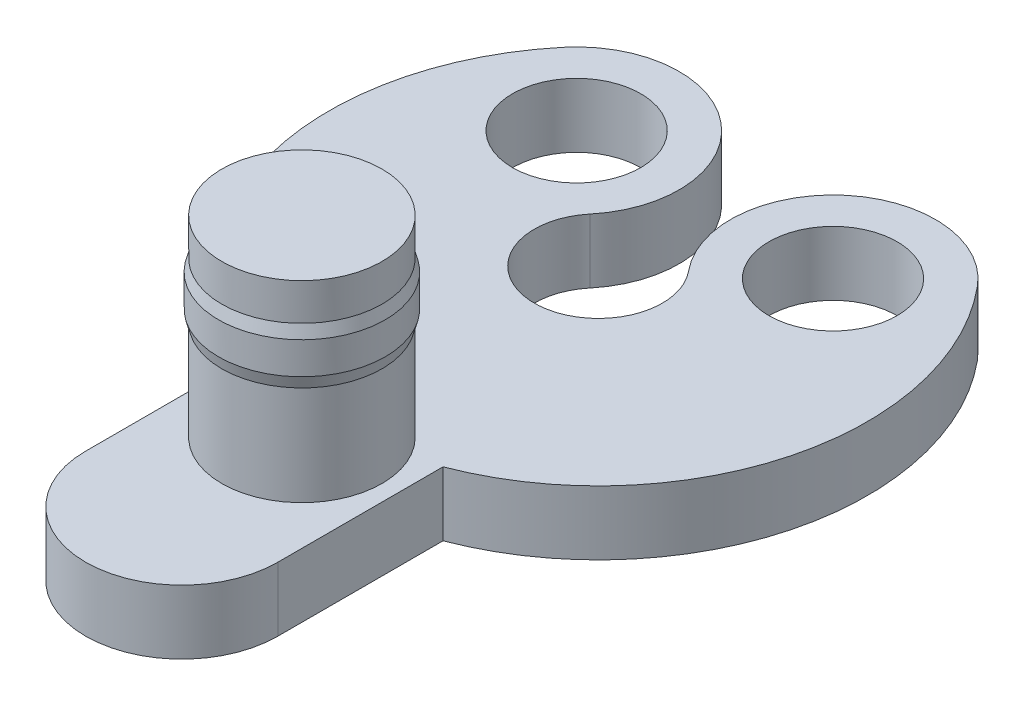
ISO-10303-21;
HEADER;
FILE_DESCRIPTION(('STEP AP214'),'2;1');
FILE_NAME('part.step','',(''),(''),'','','');
FILE_SCHEMA(('AUTOMOTIVE_DESIGN { 1 0 10303 214 1 1 1 1 }'));
ENDSEC;
DATA;
#1=APPLICATION_CONTEXT('core data for automotive mechanical design processes');
#2=APPLICATION_PROTOCOL_DEFINITION('international standard','automotive_design',2000,#1);
#3=PRODUCT_CONTEXT('',#1,'mechanical');
#4=PRODUCT('Part','Part','',(#3));
#5=PRODUCT_RELATED_PRODUCT_CATEGORY('part','',(#4));
#6=PRODUCT_DEFINITION_FORMATION('','',#4);
#7=PRODUCT_DEFINITION_CONTEXT('part definition',#1,'design');
#8=PRODUCT_DEFINITION('design','',#6,#7);
#9=PRODUCT_DEFINITION_SHAPE('','',#8);
#10=(LENGTH_UNIT() NAMED_UNIT(*) SI_UNIT(.MILLI.,.METRE.));
#11=(NAMED_UNIT(*) PLANE_ANGLE_UNIT() SI_UNIT($,.RADIAN.));
#12=(NAMED_UNIT(*) SI_UNIT($,.STERADIAN.) SOLID_ANGLE_UNIT());
#13=UNCERTAINTY_MEASURE_WITH_UNIT(LENGTH_MEASURE(1.E-05),#10,'distance_accuracy_value','');
#14=(GEOMETRIC_REPRESENTATION_CONTEXT(3) GLOBAL_UNCERTAINTY_ASSIGNED_CONTEXT((#13)) GLOBAL_UNIT_ASSIGNED_CONTEXT((#10,
#11,#12)) REPRESENTATION_CONTEXT('',''));
#15=CARTESIAN_POINT('',(0.,0.,0.));
#16=DIRECTION('',(0.,0.,1.));
#17=DIRECTION('',(1.,0.,0.));
#18=AXIS2_PLACEMENT_3D('',#15,#16,#17);
#19=CARTESIAN_POINT('',(0.,8.,9.25));
#20=DIRECTION('',(0.,-1.,0.));
#21=DIRECTION('',(0.,0.,-1.));
#22=AXIS2_PLACEMENT_3D('',#19,#20,#21);
#23=CYLINDRICAL_SURFACE('',#22,2.5);
#24=CARTESIAN_POINT('',(0.,5.1,9.25));
#25=DIRECTION('',(0.,1.,0.));
#26=DIRECTION('',(0.,0.,1.));
#27=AXIS2_PLACEMENT_3D('',#24,#25,#26);
#28=CIRCLE('',#27,2.5);
#29=CARTESIAN_POINT('',(0.,5.1,11.75));
#30=VERTEX_POINT('',#29);
#31=EDGE_CURVE('E11',#30,#30,#28,.T.);
#32=ORIENTED_EDGE('',*,*,#31,.F.);
#33=EDGE_LOOP('',(#32));
#34=FACE_BOUND('',#33,.T.);
#35=CARTESIAN_POINT('',(0.,2.,9.25));
#36=DIRECTION('',(0.,1.,0.));
#37=DIRECTION('',(0.,0.,1.));
#38=AXIS2_PLACEMENT_3D('',#35,#36,#37);
#39=CIRCLE('',#38,2.5);
#40=CARTESIAN_POINT('',(0.,2.,11.75));
#41=VERTEX_POINT('',#40);
#42=EDGE_CURVE('E145',#41,#41,#39,.T.);
#43=ORIENTED_EDGE('',*,*,#42,.T.);
#44=EDGE_LOOP('',(#43));
#45=FACE_BOUND('',#44,.T.);
#46=ADVANCED_FACE('F38',(#34,#45),#23,.T.);
#47=CARTESIAN_POINT('',(3.,2.,0.));
#48=DIRECTION('',(1.,0.,0.));
#49=DIRECTION('',(0.,0.,-1.));
#50=AXIS2_PLACEMENT_3D('',#47,#48,#49);
#51=PLANE('',#50);
#52=DIRECTION('',(0.,0.,1.));
#53=VECTOR('',#52,1.);
#54=CARTESIAN_POINT('',(3.,0.,0.));
#55=LINE('',#54,#53);
#56=CARTESIAN_POINT('',(3.,0.,7.84601809837321));
#57=VERTEX_POINT('',#56);
#58=CARTESIAN_POINT('',(3.,0.,13.));
#59=VERTEX_POINT('',#58);
#60=EDGE_CURVE('E181',#57,#59,#55,.T.);
#61=ORIENTED_EDGE('',*,*,#60,.F.);
#62=DIRECTION('',(0.,-1.,0.));
#63=VECTOR('',#62,1.);
#64=CARTESIAN_POINT('',(3.,2.,7.84601809837321));
#65=LINE('',#64,#63);
#66=CARTESIAN_POINT('',(3.,2.,7.84601809837321));
#67=VERTEX_POINT('',#66);
#68=EDGE_CURVE('E94',#67,#57,#65,.T.);
#69=ORIENTED_EDGE('',*,*,#68,.F.);
#70=DIRECTION('',(0.,0.,1.));
#71=VECTOR('',#70,1.);
#72=CARTESIAN_POINT('',(3.,2.,0.));
#73=LINE('',#72,#71);
#74=CARTESIAN_POINT('',(3.,2.,13.));
#75=VERTEX_POINT('',#74);
#76=EDGE_CURVE('E163',#67,#75,#73,.T.);
#77=ORIENTED_EDGE('',*,*,#76,.T.);
#78=DIRECTION('',(0.,-1.,0.));
#79=VECTOR('',#78,1.);
#80=CARTESIAN_POINT('',(3.,2.,13.));
#81=LINE('',#80,#79);
#82=EDGE_CURVE('E90',#75,#59,#81,.T.);
#83=ORIENTED_EDGE('',*,*,#82,.T.);
#84=EDGE_LOOP('',(#61,#69,#77,#83));
#85=FACE_BOUND('',#84,.T.);
#86=ADVANCED_FACE('F202',(#85),#51,.T.);
#87=CARTESIAN_POINT('',(0.,2.,0.));
#88=DIRECTION('',(0.,-1.,0.));
#89=DIRECTION('',(0.,0.,-1.));
#90=AXIS2_PLACEMENT_3D('',#87,#88,#89);
#91=CYLINDRICAL_SURFACE('',#90,8.4);
#92=CARTESIAN_POINT('',(0.,0.,0.));
#93=DIRECTION('',(0.,1.,0.));
#94=DIRECTION('',(0.,0.,1.));
#95=AXIS2_PLACEMENT_3D('',#92,#93,#94);
#96=CIRCLE('',#95,8.4);
#97=CARTESIAN_POINT('',(6.46153846153846,0.,-5.36735695757783));
#98=VERTEX_POINT('',#97);
#99=EDGE_CURVE('E183',#57,#98,#96,.T.);
#100=ORIENTED_EDGE('',*,*,#99,.T.);
#101=DIRECTION('',(0.,-1.,0.));
#102=VECTOR('',#101,1.);
#103=CARTESIAN_POINT('',(6.46153846153846,2.,-5.36735695757783));
#104=LINE('',#103,#102);
#105=CARTESIAN_POINT('',(6.46153846153846,2.,-5.36735695757783));
#106=VERTEX_POINT('',#105);
#107=EDGE_CURVE('E142',#106,#98,#104,.T.);
#108=ORIENTED_EDGE('',*,*,#107,.F.);
#109=CARTESIAN_POINT('',(0.,2.,0.));
#110=DIRECTION('',(0.,1.,0.));
#111=DIRECTION('',(0.,0.,1.));
#112=AXIS2_PLACEMENT_3D('',#109,#110,#111);
#113=CIRCLE('',#112,8.4);
#114=EDGE_CURVE('E165',#67,#106,#113,.T.);
#115=ORIENTED_EDGE('',*,*,#114,.F.);
#116=ORIENTED_EDGE('',*,*,#68,.T.);
#117=EDGE_LOOP('',(#100,#108,#115,#116));
#118=FACE_BOUND('',#117,.T.);
#119=ADVANCED_FACE('F204',(#118),#91,.T.);
#120=CARTESIAN_POINT('',(4.,2.,-3.32264954516723));
#121=DIRECTION('',(0.,-1.,0.));
#122=DIRECTION('',(0.,0.,-1.));
#123=AXIS2_PLACEMENT_3D('',#120,#121,#122);
#124=CYLINDRICAL_SURFACE('',#123,3.2);
#125=CARTESIAN_POINT('',(4.,0.,-3.32264954516723));
#126=DIRECTION('',(0.,1.,0.));
#127=DIRECTION('',(0.,0.,1.));
#128=AXIS2_PLACEMENT_3D('',#125,#126,#127);
#129=CIRCLE('',#128,3.2);
#130=CARTESIAN_POINT('',(1.53846153846154,0.,-1.27794213275663));
#131=VERTEX_POINT('',#130);
#132=EDGE_CURVE('E186',#98,#131,#129,.T.);
#133=ORIENTED_EDGE('',*,*,#132,.T.);
#134=DIRECTION('',(0.,-1.,0.));
#135=VECTOR('',#134,1.);
#136=CARTESIAN_POINT('',(1.53846153846154,2.,-1.27794213275663));
#137=LINE('',#136,#135);
#138=CARTESIAN_POINT('',(1.53846153846154,2.,-1.27794213275663));
#139=VERTEX_POINT('',#138);
#140=EDGE_CURVE('E140',#139,#131,#137,.T.);
#141=ORIENTED_EDGE('',*,*,#140,.F.);
#142=CARTESIAN_POINT('',(4.,2.,-3.32264954516723));
#143=DIRECTION('',(0.,1.,0.));
#144=DIRECTION('',(0.,0.,1.));
#145=AXIS2_PLACEMENT_3D('',#142,#143,#144);
#146=CIRCLE('',#145,3.2);
#147=EDGE_CURVE('E168',#106,#139,#146,.T.);
#148=ORIENTED_EDGE('',*,*,#147,.F.);
#149=ORIENTED_EDGE('',*,*,#107,.T.);
#150=EDGE_LOOP('',(#133,#141,#148,#149));
#151=FACE_BOUND('',#150,.T.);
#152=ADVANCED_FACE('F210',(#151),#124,.T.);
#153=CARTESIAN_POINT('',(0.,2.,0.));
#154=DIRECTION('',(0.,-1.,0.));
#155=DIRECTION('',(0.,0.,-1.));
#156=AXIS2_PLACEMENT_3D('',#153,#154,#155);
#157=CYLINDRICAL_SURFACE('',#156,2.);
#158=CARTESIAN_POINT('',(0.,0.,0.));
#159=DIRECTION('',(0.,1.,0.));
#160=DIRECTION('',(0.,0.,1.));
#161=AXIS2_PLACEMENT_3D('',#158,#159,#160);
#162=CIRCLE('',#161,2.);
#163=CARTESIAN_POINT('',(-1.53846153846154,0.,-1.27794213275663));
#164=VERTEX_POINT('',#163);
#165=EDGE_CURVE('E189',#164,#131,#162,.T.);
#166=ORIENTED_EDGE('',*,*,#165,.F.);
#167=DIRECTION('',(0.,-1.,0.));
#168=VECTOR('',#167,1.);
#169=CARTESIAN_POINT('',(-1.53846153846154,2.,-1.27794213275663));
#170=LINE('',#169,#168);
#171=CARTESIAN_POINT('',(-1.53846153846154,2.,-1.27794213275663));
#172=VERTEX_POINT('',#171);
#173=EDGE_CURVE('E134',#172,#164,#170,.T.);
#174=ORIENTED_EDGE('',*,*,#173,.F.);
#175=CARTESIAN_POINT('',(0.,2.,0.));
#176=DIRECTION('',(0.,1.,0.));
#177=DIRECTION('',(0.,0.,1.));
#178=AXIS2_PLACEMENT_3D('',#175,#176,#177);
#179=CIRCLE('',#178,2.);
#180=EDGE_CURVE('E170',#172,#139,#179,.T.);
#181=ORIENTED_EDGE('',*,*,#180,.T.);
#182=ORIENTED_EDGE('',*,*,#140,.T.);
#183=EDGE_LOOP('',(#166,#174,#181,#182));
#184=FACE_BOUND('',#183,.T.);
#185=ADVANCED_FACE('F252',(#184),#157,.F.);
#186=CARTESIAN_POINT('',(-4.,2.,-3.32264954516723));
#187=DIRECTION('',(0.,-1.,0.));
#188=DIRECTION('',(0.,0.,-1.));
#189=AXIS2_PLACEMENT_3D('',#186,#187,#188);
#190=CYLINDRICAL_SURFACE('',#189,3.2);
#191=CARTESIAN_POINT('',(-4.,0.,-3.32264954516723));
#192=DIRECTION('',(0.,1.,0.));
#193=DIRECTION('',(0.,0.,1.));
#194=AXIS2_PLACEMENT_3D('',#191,#192,#193);
#195=CIRCLE('',#194,3.2);
#196=CARTESIAN_POINT('',(-6.46153846153846,0.,-5.36735695757783));
#197=VERTEX_POINT('',#196);
#198=EDGE_CURVE('E192',#197,#164,#195,.F.);
#199=ORIENTED_EDGE('',*,*,#198,.F.);
#200=DIRECTION('',(0.,-1.,0.));
#201=VECTOR('',#200,1.);
#202=CARTESIAN_POINT('',(-6.46153846153846,2.,-5.36735695757783));
#203=LINE('',#202,#201);
#204=CARTESIAN_POINT('',(-6.46153846153846,2.,-5.36735695757783));
#205=VERTEX_POINT('',#204);
#206=EDGE_CURVE('E132',#205,#197,#203,.T.);
#207=ORIENTED_EDGE('',*,*,#206,.F.);
#208=CARTESIAN_POINT('',(-4.,2.,-3.32264954516723));
#209=DIRECTION('',(0.,1.,0.));
#210=DIRECTION('',(0.,0.,1.));
#211=AXIS2_PLACEMENT_3D('',#208,#209,#210);
#212=CIRCLE('',#211,3.2);
#213=EDGE_CURVE('E126',#205,#172,#212,.F.);
#214=ORIENTED_EDGE('',*,*,#213,.T.);
#215=ORIENTED_EDGE('',*,*,#173,.T.);
#216=EDGE_LOOP('',(#199,#207,#214,#215));
#217=FACE_BOUND('',#216,.T.);
#218=ADVANCED_FACE('F249',(#217),#190,.T.);
#219=CARTESIAN_POINT('',(0.,2.,0.));
#220=DIRECTION('',(0.,-1.,0.));
#221=DIRECTION('',(0.,0.,-1.));
#222=AXIS2_PLACEMENT_3D('',#219,#220,#221);
#223=CYLINDRICAL_SURFACE('',#222,8.4);
#224=CARTESIAN_POINT('',(0.,0.,0.));
#225=DIRECTION('',(0.,1.,0.));
#226=DIRECTION('',(0.,0.,1.));
#227=AXIS2_PLACEMENT_3D('',#224,#225,#226);
#228=CIRCLE('',#227,8.4);
#229=CARTESIAN_POINT('',(-3.,0.,7.84601809837321));
#230=VERTEX_POINT('',#229);
#231=EDGE_CURVE('E131',#197,#230,#228,.T.);
#232=ORIENTED_EDGE('',*,*,#231,.T.);
#233=DIRECTION('',(0.,-1.,0.));
#234=VECTOR('',#233,1.);
#235=CARTESIAN_POINT('',(-3.,2.,7.84601809837321));
#236=LINE('',#235,#234);
#237=CARTESIAN_POINT('',(-3.,2.,7.84601809837321));
#238=VERTEX_POINT('',#237);
#239=EDGE_CURVE('E116',#238,#230,#236,.T.);
#240=ORIENTED_EDGE('',*,*,#239,.F.);
#241=CARTESIAN_POINT('',(0.,2.,0.));
#242=DIRECTION('',(0.,1.,0.));
#243=DIRECTION('',(0.,0.,1.));
#244=AXIS2_PLACEMENT_3D('',#241,#242,#243);
#245=CIRCLE('',#244,8.4);
#246=EDGE_CURVE('E119',#205,#238,#245,.T.);
#247=ORIENTED_EDGE('',*,*,#246,.F.);
#248=ORIENTED_EDGE('',*,*,#206,.T.);
#249=EDGE_LOOP('',(#232,#240,#247,#248));
#250=FACE_BOUND('',#249,.T.);
#251=ADVANCED_FACE('F129',(#250),#223,.T.);
#252=CARTESIAN_POINT('',(-3.,2.,0.));
#253=DIRECTION('',(1.,0.,0.));
#254=DIRECTION('',(0.,0.,-1.));
#255=AXIS2_PLACEMENT_3D('',#252,#253,#254);
#256=PLANE('',#255);
#257=DIRECTION('',(0.,0.,1.));
#258=VECTOR('',#257,1.);
#259=CARTESIAN_POINT('',(-3.,0.,0.));
#260=LINE('',#259,#258);
#261=CARTESIAN_POINT('',(-3.,0.,13.));
#262=VERTEX_POINT('',#261);
#263=EDGE_CURVE('E196',#230,#262,#260,.T.);
#264=ORIENTED_EDGE('',*,*,#263,.T.);
#265=DIRECTION('',(0.,-1.,0.));
#266=VECTOR('',#265,1.);
#267=CARTESIAN_POINT('',(-3.,2.,13.));
#268=LINE('',#267,#266);
#269=CARTESIAN_POINT('',(-3.,2.,13.));
#270=VERTEX_POINT('',#269);
#271=EDGE_CURVE('E118',#270,#262,#268,.T.);
#272=ORIENTED_EDGE('',*,*,#271,.F.);
#273=DIRECTION('',(0.,0.,1.));
#274=VECTOR('',#273,1.);
#275=CARTESIAN_POINT('',(-3.,2.,0.));
#276=LINE('',#275,#274);
#277=EDGE_CURVE('E111',#238,#270,#276,.T.);
#278=ORIENTED_EDGE('',*,*,#277,.F.);
#279=ORIENTED_EDGE('',*,*,#239,.T.);
#280=EDGE_LOOP('',(#264,#272,#278,#279));
#281=FACE_BOUND('',#280,.T.);
#282=ADVANCED_FACE('F114',(#281),#256,.F.);
#283=CARTESIAN_POINT('',(-4.,2.,-3.32264954516723));
#284=DIRECTION('',(0.,-1.,0.));
#285=DIRECTION('',(0.,0.,-1.));
#286=AXIS2_PLACEMENT_3D('',#283,#284,#285);
#287=CYLINDRICAL_SURFACE('',#286,2.);
#288=CARTESIAN_POINT('',(-4.,2.,-3.32264954516723));
#289=DIRECTION('',(0.,1.,0.));
#290=DIRECTION('',(0.,0.,1.));
#291=AXIS2_PLACEMENT_3D('',#288,#289,#290);
#292=CIRCLE('',#291,2.);
#293=CARTESIAN_POINT('',(-4.,2.,-1.32264954516723));
#294=VERTEX_POINT('',#293);
#295=EDGE_CURVE('E160',#294,#294,#292,.T.);
#296=ORIENTED_EDGE('',*,*,#295,.T.);
#297=EDGE_LOOP('',(#296));
#298=FACE_BOUND('',#297,.T.);
#299=CARTESIAN_POINT('',(-4.,0.,-3.32264954516723));
#300=DIRECTION('',(0.,1.,0.));
#301=DIRECTION('',(0.,0.,1.));
#302=AXIS2_PLACEMENT_3D('',#299,#300,#301);
#303=CIRCLE('',#302,2.);
#304=CARTESIAN_POINT('',(-4.,0.,-1.32264954516723));
#305=VERTEX_POINT('',#304);
#306=EDGE_CURVE('E178',#305,#305,#303,.T.);
#307=ORIENTED_EDGE('',*,*,#306,.F.);
#308=EDGE_LOOP('',(#307));
#309=FACE_BOUND('',#308,.T.);
#310=ADVANCED_FACE('F217',(#298,#309),#287,.F.);
#311=CARTESIAN_POINT('',(4.,2.,-3.32264954516723));
#312=DIRECTION('',(0.,-1.,0.));
#313=DIRECTION('',(0.,0.,-1.));
#314=AXIS2_PLACEMENT_3D('',#311,#312,#313);
#315=CYLINDRICAL_SURFACE('',#314,2.);
#316=CARTESIAN_POINT('',(4.,2.,-3.32264954516723));
#317=DIRECTION('',(0.,1.,0.));
#318=DIRECTION('',(0.,0.,1.));
#319=AXIS2_PLACEMENT_3D('',#316,#317,#318);
#320=CIRCLE('',#319,2.);
#321=CARTESIAN_POINT('',(4.,2.,-1.32264954516723));
#322=VERTEX_POINT('',#321);
#323=EDGE_CURVE('E157',#322,#322,#320,.F.);
#324=ORIENTED_EDGE('',*,*,#323,.F.);
#325=EDGE_LOOP('',(#324));
#326=FACE_BOUND('',#325,.T.);
#327=CARTESIAN_POINT('',(4.,0.,-3.32264954516723));
#328=DIRECTION('',(0.,1.,0.));
#329=DIRECTION('',(0.,0.,1.));
#330=AXIS2_PLACEMENT_3D('',#327,#328,#329);
#331=CIRCLE('',#330,2.);
#332=CARTESIAN_POINT('',(4.,0.,-1.32264954516723));
#333=VERTEX_POINT('',#332);
#334=EDGE_CURVE('E175',#333,#333,#331,.F.);
#335=ORIENTED_EDGE('',*,*,#334,.T.);
#336=EDGE_LOOP('',(#335));
#337=FACE_BOUND('',#336,.T.);
#338=ADVANCED_FACE('F40',(#326,#337),#315,.F.);
#339=CARTESIAN_POINT('',(0.,2.,13.));
#340=DIRECTION('',(0.,-1.,0.));
#341=DIRECTION('',(0.,0.,-1.));
#342=AXIS2_PLACEMENT_3D('',#339,#340,#341);
#343=CYLINDRICAL_SURFACE('',#342,3.);
#344=CARTESIAN_POINT('',(0.,0.,13.));
#345=DIRECTION('',(0.,1.,0.));
#346=DIRECTION('',(0.,0.,1.));
#347=AXIS2_PLACEMENT_3D('',#344,#345,#346);
#348=CIRCLE('',#347,3.);
#349=EDGE_CURVE('E83',#262,#59,#348,.T.);
#350=ORIENTED_EDGE('',*,*,#349,.T.);
#351=ORIENTED_EDGE('',*,*,#82,.F.);
#352=CARTESIAN_POINT('',(0.,2.,13.));
#353=DIRECTION('',(0.,1.,0.));
#354=DIRECTION('',(0.,0.,1.));
#355=AXIS2_PLACEMENT_3D('',#352,#353,#354);
#356=CIRCLE('',#355,3.);
#357=EDGE_CURVE('E55',#270,#75,#356,.T.);
#358=ORIENTED_EDGE('',*,*,#357,.F.);
#359=ORIENTED_EDGE('',*,*,#271,.T.);
#360=EDGE_LOOP('',(#350,#351,#358,#359));
#361=FACE_BOUND('',#360,.T.);
#362=ADVANCED_FACE('F199',(#361),#343,.T.);
#363=CARTESIAN_POINT('',(0.,2.,0.));
#364=DIRECTION('',(0.,1.,0.));
#365=DIRECTION('',(0.,0.,1.));
#366=AXIS2_PLACEMENT_3D('',#363,#364,#365);
#367=PLANE('',#366);
#368=ORIENTED_EDGE('',*,*,#42,.F.);
#369=EDGE_LOOP('',(#368));
#370=FACE_BOUND('',#369,.T.);
#371=ORIENTED_EDGE('',*,*,#323,.T.);
#372=EDGE_LOOP('',(#371));
#373=FACE_BOUND('',#372,.T.);
#374=ORIENTED_EDGE('',*,*,#295,.F.);
#375=EDGE_LOOP('',(#374));
#376=FACE_BOUND('',#375,.T.);
#377=ORIENTED_EDGE('',*,*,#76,.F.);
#378=ORIENTED_EDGE('',*,*,#114,.T.);
#379=ORIENTED_EDGE('',*,*,#147,.T.);
#380=ORIENTED_EDGE('',*,*,#180,.F.);
#381=ORIENTED_EDGE('',*,*,#213,.F.);
#382=ORIENTED_EDGE('',*,*,#246,.T.);
#383=ORIENTED_EDGE('',*,*,#277,.T.);
#384=ORIENTED_EDGE('',*,*,#357,.T.);
#385=EDGE_LOOP('',(#377,#378,#379,#380,#381,#382,#383,#384));
#386=FACE_BOUND('',#385,.T.);
#387=ADVANCED_FACE('F123',(#370,#373,#376,#386),#367,.T.);
#388=CARTESIAN_POINT('',(0.,0.,0.));
#389=DIRECTION('',(0.,1.,0.));
#390=DIRECTION('',(0.,0.,1.));
#391=AXIS2_PLACEMENT_3D('',#388,#389,#390);
#392=PLANE('',#391);
#393=ORIENTED_EDGE('',*,*,#334,.F.);
#394=EDGE_LOOP('',(#393));
#395=FACE_BOUND('',#394,.T.);
#396=ORIENTED_EDGE('',*,*,#306,.T.);
#397=EDGE_LOOP('',(#396));
#398=FACE_BOUND('',#397,.T.);
#399=ORIENTED_EDGE('',*,*,#60,.T.);
#400=ORIENTED_EDGE('',*,*,#349,.F.);
#401=ORIENTED_EDGE('',*,*,#263,.F.);
#402=ORIENTED_EDGE('',*,*,#231,.F.);
#403=ORIENTED_EDGE('',*,*,#198,.T.);
#404=ORIENTED_EDGE('',*,*,#165,.T.);
#405=ORIENTED_EDGE('',*,*,#132,.F.);
#406=ORIENTED_EDGE('',*,*,#99,.F.);
#407=EDGE_LOOP('',(#399,#400,#401,#402,#403,#404,#405,#406));
#408=FACE_BOUND('',#407,.T.);
#409=ADVANCED_FACE('F201',(#395,#398,#408),#392,.F.);
#410=CARTESIAN_POINT('',(0.,5.1,9.25));
#411=DIRECTION('',(0.,1.,0.));
#412=DIRECTION('',(0.,0.,1.));
#413=AXIS2_PLACEMENT_3D('',#410,#411,#412);
#414=CONICAL_SURFACE('',#413,2.5,0.261799387799145);
#415=CARTESIAN_POINT('',(0.,5.47320508075689,9.25));
#416=DIRECTION('',(0.,-1.,0.));
#417=DIRECTION('',(0.,0.,-1.));
#418=AXIS2_PLACEMENT_3D('',#415,#416,#417);
#419=CIRCLE('',#418,2.6);
#420=CARTESIAN_POINT('',(0.,5.47320508075689,6.65));
#421=VERTEX_POINT('',#420);
#422=EDGE_CURVE('E367',#421,#421,#419,.T.);
#423=ORIENTED_EDGE('',*,*,#422,.T.);
#424=EDGE_LOOP('',(#423));
#425=FACE_BOUND('',#424,.T.);
#426=ORIENTED_EDGE('',*,*,#31,.T.);
#427=EDGE_LOOP('',(#426));
#428=FACE_BOUND('',#427,.T.);
#429=ADVANCED_FACE('F231',(#425,#428),#414,.T.);
#430=CARTESIAN_POINT('',(0.,2.,9.25));
#431=DIRECTION('',(0.,-1.,0.));
#432=DIRECTION('',(0.,0.,-1.));
#433=AXIS2_PLACEMENT_3D('',#430,#431,#432);
#434=CYLINDRICAL_SURFACE('',#433,2.6);
#435=CARTESIAN_POINT('',(0.,6.47320508075689,9.25));
#436=DIRECTION('',(0.,-1.,0.));
#437=DIRECTION('',(0.,0.,-1.));
#438=AXIS2_PLACEMENT_3D('',#435,#436,#437);
#439=CIRCLE('',#438,2.6);
#440=CARTESIAN_POINT('',(0.,6.47320508075689,6.65));
#441=VERTEX_POINT('',#440);
#442=EDGE_CURVE('E369',#441,#441,#439,.T.);
#443=ORIENTED_EDGE('',*,*,#442,.T.);
#444=EDGE_LOOP('',(#443));
#445=FACE_BOUND('',#444,.T.);
#446=ORIENTED_EDGE('',*,*,#422,.F.);
#447=EDGE_LOOP('',(#446));
#448=FACE_BOUND('',#447,.T.);
#449=ADVANCED_FACE('F238',(#445,#448),#434,.T.);
#450=CARTESIAN_POINT('',(0.,6.47320508075689,9.25));
#451=DIRECTION('',(0.,-1.,0.));
#452=DIRECTION('',(0.,0.,-1.));
#453=AXIS2_PLACEMENT_3D('',#450,#451,#452);
#454=CONICAL_SURFACE('',#453,2.6,0.261799387799146);
#455=CARTESIAN_POINT('',(0.,6.84641016151379,9.25));
#456=DIRECTION('',(0.,1.,0.));
#457=DIRECTION('',(0.,0.,1.));
#458=AXIS2_PLACEMENT_3D('',#455,#456,#457);
#459=CIRCLE('',#458,2.5);
#460=CARTESIAN_POINT('',(0.,6.84641016151379,11.75));
#461=VERTEX_POINT('',#460);
#462=EDGE_CURVE('E47',#461,#461,#459,.F.);
#463=ORIENTED_EDGE('',*,*,#462,.T.);
#464=EDGE_LOOP('',(#463));
#465=FACE_BOUND('',#464,.T.);
#466=ORIENTED_EDGE('',*,*,#442,.F.);
#467=EDGE_LOOP('',(#466));
#468=FACE_BOUND('',#467,.T.);
#469=ADVANCED_FACE('F323',(#465,#468),#454,.T.);
#470=CARTESIAN_POINT('',(0.,8.,9.25));
#471=DIRECTION('',(0.,-1.,0.));
#472=DIRECTION('',(0.,0.,-1.));
#473=AXIS2_PLACEMENT_3D('',#470,#471,#472);
#474=PLANE('',#473);
#475=CARTESIAN_POINT('',(0.,8.,9.25));
#476=DIRECTION('',(0.,-1.,0.));
#477=DIRECTION('',(0.,0.,-1.));
#478=AXIS2_PLACEMENT_3D('',#475,#476,#477);
#479=CIRCLE('',#478,2.5);
#480=CARTESIAN_POINT('',(0.,8.,6.75));
#481=VERTEX_POINT('',#480);
#482=EDGE_CURVE('E155',#481,#481,#479,.T.);
#483=ORIENTED_EDGE('',*,*,#482,.F.);
#484=EDGE_LOOP('',(#483));
#485=FACE_BOUND('',#484,.T.);
#486=ADVANCED_FACE('F318',(#485),#474,.F.);
#487=ORIENTED_EDGE('',*,*,#462,.F.);
#488=EDGE_LOOP('',(#487));
#489=FACE_BOUND('',#488,.T.);
#490=ORIENTED_EDGE('',*,*,#482,.T.);
#491=EDGE_LOOP('',(#490));
#492=FACE_BOUND('',#491,.T.);
#493=ADVANCED_FACE('F215',(#489,#492),#23,.T.);
#494=CLOSED_SHELL('',(#46,#86,#119,#152,#185,#218,#251,#282,#310,#338,#362,#387,#409,#429,#449,
#469,#486,#493));
#495=MANIFOLD_SOLID_BREP('B2',#494);
#496=ADVANCED_BREP_SHAPE_REPRESENTATION('',(#18,#495),#14);
#497=SHAPE_DEFINITION_REPRESENTATION(#9,#496);
ENDSEC;
END-ISO-10303-21;
